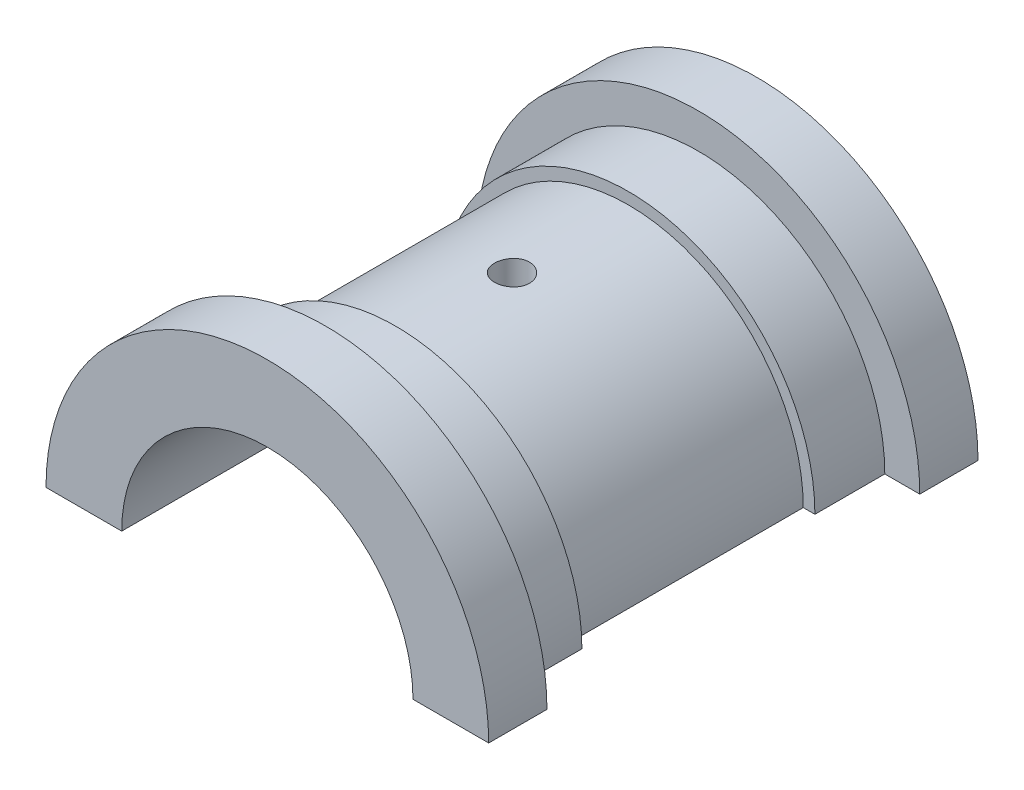
ISO-10303-21;
HEADER;
FILE_DESCRIPTION(('STEP AP214'),'2;1');
FILE_NAME('part.step','',(''),(''),'','','');
FILE_SCHEMA(('AUTOMOTIVE_DESIGN { 1 0 10303 214 1 1 1 1 }'));
ENDSEC;
DATA;
#1=APPLICATION_CONTEXT('core data for automotive mechanical design processes');
#2=APPLICATION_PROTOCOL_DEFINITION('international standard','automotive_design',2000,#1);
#3=PRODUCT_CONTEXT('',#1,'mechanical');
#4=PRODUCT('Part','Part','',(#3));
#5=PRODUCT_RELATED_PRODUCT_CATEGORY('part','',(#4));
#6=PRODUCT_DEFINITION_FORMATION('','',#4);
#7=PRODUCT_DEFINITION_CONTEXT('part definition',#1,'design');
#8=PRODUCT_DEFINITION('design','',#6,#7);
#9=PRODUCT_DEFINITION_SHAPE('','',#8);
#10=(LENGTH_UNIT() NAMED_UNIT(*) SI_UNIT(.MILLI.,.METRE.));
#11=(NAMED_UNIT(*) PLANE_ANGLE_UNIT() SI_UNIT($,.RADIAN.));
#12=(NAMED_UNIT(*) SI_UNIT($,.STERADIAN.) SOLID_ANGLE_UNIT());
#13=UNCERTAINTY_MEASURE_WITH_UNIT(LENGTH_MEASURE(1.E-05),#10,'distance_accuracy_value','');
#14=(GEOMETRIC_REPRESENTATION_CONTEXT(3) GLOBAL_UNCERTAINTY_ASSIGNED_CONTEXT((#13)) GLOBAL_UNIT_ASSIGNED_CONTEXT((#10,
#11,#12)) REPRESENTATION_CONTEXT('',''));
#15=CARTESIAN_POINT('',(0.,0.,0.));
#16=DIRECTION('',(0.,0.,1.));
#17=DIRECTION('',(1.,0.,0.));
#18=AXIS2_PLACEMENT_3D('',#15,#16,#17);
#19=CARTESIAN_POINT('',(0.,0.,0.));
#20=DIRECTION('',(0.,0.,1.));
#21=DIRECTION('',(1.,0.,0.));
#22=AXIS2_PLACEMENT_3D('',#19,#20,#21);
#23=CYLINDRICAL_SURFACE('',#22,25.);
#24=CARTESIAN_POINT('',(0.,25.,3.));
#25=CARTESIAN_POINT('',(0.167864047107699,24.9999977357459,2.99999283605857));
#26=CARTESIAN_POINT('',(0.335834317331191,24.9982914200408,2.98586334130732));
#27=CARTESIAN_POINT('',(0.66710457130825,24.991648705422,2.92971893584462));
#28=CARTESIAN_POINT('',(0.830399429590069,24.9867088933728,2.88767455874941));
#29=CARTESIAN_POINT('',(1.14747479534053,24.9741559265426,2.77695372347399));
#30=CARTESIAN_POINT('',(1.30126148759225,24.9665445315309,2.70829479317582));
#31=CARTESIAN_POINT('',(1.595099157832,24.9494959264345,2.5463312649167));
#32=CARTESIAN_POINT('',(1.73515256713516,24.9400590404141,2.45303104024669));
#33=CARTESIAN_POINT('',(1.99829131534451,24.920360105442,2.24392513802476));
#34=CARTESIAN_POINT('',(2.1212966913072,24.9100945030904,2.12801915988808));
#35=CARTESIAN_POINT('',(2.34615931038342,24.8899239397152,1.8772070351121));
#36=CARTESIAN_POINT('',(2.44801549826474,24.8800189967068,1.74229994098135));
#37=CARTESIAN_POINT('',(2.62798342873896,24.8616560370405,1.45679917470162));
#38=CARTESIAN_POINT('',(2.7060207567257,24.8532025903971,1.30615827541986));
#39=CARTESIAN_POINT('',(2.8356605730156,24.8387461344686,0.993791297891255));
#40=CARTESIAN_POINT('',(2.88726398696776,24.8327430393798,0.832065608030697));
#41=CARTESIAN_POINT('',(2.96232930045399,24.8239006073737,0.502947140688578));
#42=CARTESIAN_POINT('',(2.98592577987646,24.8210461452543,0.335585471572324));
#43=CARTESIAN_POINT('',(3.0047237521967,24.8187777690611,-0.000744936364164433));
#44=CARTESIAN_POINT('',(2.99992630052848,24.8193637271033,-0.169713615216966));
#45=CARTESIAN_POINT('',(2.96218316078668,24.8238961466306,-0.503525964784349));
#46=CARTESIAN_POINT('',(2.92938543222303,24.8278249434675,-0.668386638680178));
#47=CARTESIAN_POINT('',(2.83680346170067,24.8385728087608,-0.990247027821361));
#48=CARTESIAN_POINT('',(2.77701871225814,24.8453919315688,-1.147246595179));
#49=CARTESIAN_POINT('',(2.63199980699862,24.8611722079476,-1.44938946823911));
#50=CARTESIAN_POINT('',(2.54670106203925,24.8701387862198,-1.59450147835355));
#51=CARTESIAN_POINT('',(2.35312173169469,24.8891993987901,-1.86840721091576));
#52=CARTESIAN_POINT('',(2.24484017723157,24.8992934806213,-1.99720024490257));
#53=CARTESIAN_POINT('',(2.0075475556218,24.9195503308637,-2.23567108436438));
#54=CARTESIAN_POINT('',(1.87840890051216,24.929713127424,-2.34522196985706));
#55=CARTESIAN_POINT('',(1.60350795893872,24.9489020798549,-2.54111152100031));
#56=CARTESIAN_POINT('',(1.45774563908005,24.9579282334421,-2.62745014001915));
#57=CARTESIAN_POINT('',(1.15363930826285,24.9738318861702,-2.77446328563966));
#58=CARTESIAN_POINT('',(0.995291578715591,24.9807087472809,-2.83513019333044));
#59=CARTESIAN_POINT('',(0.67055602227344,24.991533065309,-2.9289787378509));
#60=CARTESIAN_POINT('',(0.504168542441623,24.9954806485584,-2.96216156000448));
#61=CARTESIAN_POINT('',(0.169174396374217,24.9999852500304,-2.99993625549769));
#62=CARTESIAN_POINT('',(0.000587720432051444,25.0005630093753,-3.0047030324007));
#63=CARTESIAN_POINT('',(-0.33498206824326,24.9983187823231,-2.98597142213173));
#64=CARTESIAN_POINT('',(-0.501965212327328,24.9954968625308,-2.96247358870465));
#65=CARTESIAN_POINT('',(-0.829074263928356,24.9867833380686,-2.88802503599691));
#66=CARTESIAN_POINT('',(-0.989219346369034,24.9809010237909,-2.83715738694992));
#67=CARTESIAN_POINT('',(-1.29870539768646,24.9667255501792,-2.70949929664642));
#68=CARTESIAN_POINT('',(-1.44804602592347,24.9584323148759,-2.63270803850991));
#69=CARTESIAN_POINT('',(-1.73246717766504,24.9403085158695,-2.45495708409757));
#70=CARTESIAN_POINT('',(-1.86747628962751,24.9304708084643,-2.35388386218918));
#71=CARTESIAN_POINT('',(-2.11867625152203,24.9103817919419,-2.13059915359183));
#72=CARTESIAN_POINT('',(-2.23486641472949,24.9001304677484,-2.00838689585205));
#73=CARTESIAN_POINT('',(-2.44574795226154,24.8803059484942,-1.74552438457231));
#74=CARTESIAN_POINT('',(-2.54032363231939,24.8707365831307,-1.60478098465615));
#75=CARTESIAN_POINT('',(-2.70449314429332,24.8534214993383,-1.30930497492444));
#76=CARTESIAN_POINT('',(-2.77408744356074,24.8456757467943,-1.15457262688176));
#77=CARTESIAN_POINT('',(-2.88612996668159,24.8329105734502,-0.835889391105305));
#78=CARTESIAN_POINT('',(-2.92864420159346,24.8278845275633,-0.671961988140609));
#79=CARTESIAN_POINT('',(-2.98553272163516,24.8211085274587,-0.339231030514933));
#80=CARTESIAN_POINT('',(-2.99990820526081,24.8193584337106,-0.170427683842674));
#81=CARTESIAN_POINT('',(-3.00009033817931,24.819336326607,0.166112729637174));
#82=CARTESIAN_POINT('',(-2.98607873671351,24.8210421863943,0.333849725771266));
#83=CARTESIAN_POINT('',(-2.93026848672089,24.8276922947425,0.664566786394168));
#84=CARTESIAN_POINT('',(-2.88846982822067,24.8326365444656,0.827546849175586));
#85=CARTESIAN_POINT('',(-2.77832739820545,24.8451996524586,1.1441045388887));
#86=CARTESIAN_POINT('',(-2.70999165570539,24.8528177016812,1.29768499349548));
#87=CARTESIAN_POINT('',(-2.5487328262801,24.8698714539139,1.5912277470701));
#88=CARTESIAN_POINT('',(-2.45580952709445,24.8793071726153,1.73118992845931));
#89=CARTESIAN_POINT('',(-2.24733689647205,24.8990055122588,1.99445294010884));
#90=CARTESIAN_POINT('',(-2.1316520393015,24.9092728581347,2.11764610326628));
#91=CARTESIAN_POINT('',(-1.88122093334447,24.9294354968169,2.342942479566));
#92=CARTESIAN_POINT('',(-1.74647018263601,24.939330701051,2.44504069762919));
#93=CARTESIAN_POINT('',(-1.46119322465137,24.9576721709324,2.62555057799886));
#94=CARTESIAN_POINT('',(-1.31061323462417,24.966113221621,2.70387772572229));
#95=CARTESIAN_POINT('',(-0.99842275168531,24.9805418519727,2.83402376444257));
#96=CARTESIAN_POINT('',(-0.836824564362144,24.9865321180615,2.88587169618039));
#97=CARTESIAN_POINT('',(-0.561977101236697,24.9939268325999,2.94906342033812));
#98=CARTESIAN_POINT('',(-0.450466569753487,24.996193279433,2.96813748388637));
#99=CARTESIAN_POINT('',(-0.225986735693694,24.9992306204204,2.99360814349096));
#100=CARTESIAN_POINT('',(-0.113017442753625,25.0000015244492,3.00000482325045));
#101=CARTESIAN_POINT('',(0.,25.,3.));
#102=B_SPLINE_CURVE_WITH_KNOTS('',3,(#24,#25,#26,#27,#28,#29,#30,#31,#32,#33,#34,#35,#36,#37,
#38,#39,#40,#41,#42,#43,#44,#45,#46,#47,#48,#49,#50,#51,#52,#53,#54,#55,#56,#57,#58,#59,#60,#61,
#62,#63,#64,#65,#66,#67,#68,#69,#70,#71,#72,#73,#74,#75,#76,#77,#78,#79,#80,#81,#82,#83,#84,#85,
#86,#87,#88,#89,#90,#91,#92,#93,#94,#95,#96,#97,#98,#99,#100,#101),.UNSPECIFIED.,.T.,.F.,(4,2,2,
2,2,2,2,2,2,2,2,2,2,2,2,2,2,2,2,2,2,2,2,2,2,2,2,2,2,2,2,2,2,2,2,2,2,2,4),(0.,0.503179350956159,
1.00689069408623,1.5102708637556,2.01356175441693,2.51913872195878,3.02474090904883,
3.53190689496397,4.03905511999113,4.54375638343279,5.0484388866848,5.55047092912253,
6.05251241253396,6.55583573710536,7.05918028869262,7.56572944640317,8.07227962172601,
8.57898002694278,9.08565857822619,9.58921522624226,10.0927620090108,10.5947890255775,
11.0968318630167,11.6012692178556,12.1057249760356,12.6128207581672,13.119907053063,
13.6257524826489,14.1315763666154,14.6341719319229,15.1367676776234,15.6392114771388,
16.1416596143121,16.6471952402032,17.1528504352009,17.6602829023946,18.1671576479275,
18.5059342945627,18.8447087043981),.UNSPECIFIED.);
#103=CARTESIAN_POINT('',(0.,25.,3.));
#104=VERTEX_POINT('',#103);
#105=EDGE_CURVE('E150',#104,#104,#102,.T.);
#106=ORIENTED_EDGE('',*,*,#105,.T.);
#107=EDGE_LOOP('',(#106));
#108=FACE_BOUND('',#107,.T.);
#109=CARTESIAN_POINT('',(0.,0.,-42.));
#110=DIRECTION('',(0.,0.,1.));
#111=DIRECTION('',(1.,0.,0.));
#112=AXIS2_PLACEMENT_3D('',#109,#110,#111);
#113=CIRCLE('',#112,25.);
#114=CARTESIAN_POINT('',(25.,0.,-42.));
#115=VERTEX_POINT('',#114);
#116=CARTESIAN_POINT('',(-25.,0.,-42.));
#117=VERTEX_POINT('',#116);
#118=EDGE_CURVE('E46',#115,#117,#113,.T.);
#119=ORIENTED_EDGE('',*,*,#118,.F.);
#120=DIRECTION('',(0.,0.,-1.));
#121=VECTOR('',#120,1.);
#122=CARTESIAN_POINT('',(25.,0.,0.));
#123=LINE('',#122,#121);
#124=CARTESIAN_POINT('',(25.,0.,42.));
#125=VERTEX_POINT('',#124);
#126=EDGE_CURVE('E153',#125,#115,#123,.T.);
#127=ORIENTED_EDGE('',*,*,#126,.F.);
#128=CARTESIAN_POINT('',(0.,0.,42.));
#129=DIRECTION('',(0.,0.,1.));
#130=DIRECTION('',(1.,0.,0.));
#131=AXIS2_PLACEMENT_3D('',#128,#129,#130);
#132=CIRCLE('',#131,25.);
#133=CARTESIAN_POINT('',(-25.,0.,42.));
#134=VERTEX_POINT('',#133);
#135=EDGE_CURVE('E141',#125,#134,#132,.T.);
#136=ORIENTED_EDGE('',*,*,#135,.T.);
#137=DIRECTION('',(0.,0.,-1.));
#138=VECTOR('',#137,1.);
#139=CARTESIAN_POINT('',(-25.,0.,0.));
#140=LINE('',#139,#138);
#141=EDGE_CURVE('E130',#134,#117,#140,.T.);
#142=ORIENTED_EDGE('',*,*,#141,.T.);
#143=EDGE_LOOP('',(#119,#127,#136,#142));
#144=FACE_BOUND('',#143,.T.);
#145=ADVANCED_FACE('F33',(#108,#144),#23,.F.);
#146=CARTESIAN_POINT('',(25.,0.,-42.));
#147=DIRECTION('',(0.,0.,1.));
#148=DIRECTION('',(1.,0.,0.));
#149=AXIS2_PLACEMENT_3D('',#146,#147,#148);
#150=PLANE('',#149);
#151=CARTESIAN_POINT('',(0.,0.,-42.));
#152=DIRECTION('',(0.,0.,1.));
#153=DIRECTION('',(1.,0.,0.));
#154=AXIS2_PLACEMENT_3D('',#151,#152,#153);
#155=CIRCLE('',#154,38.);
#156=CARTESIAN_POINT('',(38.,-1.32676290876039E-13,-42.));
#157=VERTEX_POINT('',#156);
#158=CARTESIAN_POINT('',(-38.,-1.32676290876039E-13,-42.));
#159=VERTEX_POINT('',#158);
#160=EDGE_CURVE('E195',#157,#159,#155,.T.);
#161=ORIENTED_EDGE('',*,*,#160,.F.);
#162=DIRECTION('',(1.,0.,0.));
#163=VECTOR('',#162,1.);
#164=CARTESIAN_POINT('',(25.,0.,-42.));
#165=LINE('',#164,#163);
#166=EDGE_CURVE('E174',#115,#157,#165,.T.);
#167=ORIENTED_EDGE('',*,*,#166,.F.);
#168=ORIENTED_EDGE('',*,*,#118,.T.);
#169=DIRECTION('',(-1.,0.,0.));
#170=VECTOR('',#169,1.);
#171=CARTESIAN_POINT('',(-25.,0.,-42.));
#172=LINE('',#171,#170);
#173=EDGE_CURVE('E138',#117,#159,#172,.T.);
#174=ORIENTED_EDGE('',*,*,#173,.T.);
#175=EDGE_LOOP('',(#161,#167,#168,#174));
#176=FACE_BOUND('',#175,.T.);
#177=ADVANCED_FACE('F198',(#176),#150,.F.);
#178=CARTESIAN_POINT('',(0.,0.,0.));
#179=DIRECTION('',(0.,0.,1.));
#180=DIRECTION('',(1.,0.,0.));
#181=AXIS2_PLACEMENT_3D('',#178,#179,#180);
#182=CYLINDRICAL_SURFACE('',#181,38.);
#183=CARTESIAN_POINT('',(0.,0.,-32.));
#184=DIRECTION('',(0.,0.,1.));
#185=DIRECTION('',(1.,0.,0.));
#186=AXIS2_PLACEMENT_3D('',#183,#184,#185);
#187=CIRCLE('',#186,38.);
#188=CARTESIAN_POINT('',(38.,-1.32676290876039E-13,-32.));
#189=VERTEX_POINT('',#188);
#190=CARTESIAN_POINT('',(-38.,-1.32676290876039E-13,-32.));
#191=VERTEX_POINT('',#190);
#192=EDGE_CURVE('E193',#189,#191,#187,.T.);
#193=ORIENTED_EDGE('',*,*,#192,.F.);
#194=DIRECTION('',(0.,0.,1.));
#195=VECTOR('',#194,1.);
#196=CARTESIAN_POINT('',(38.,-1.32676290876039E-13,-42.));
#197=LINE('',#196,#195);
#198=EDGE_CURVE('E177',#157,#189,#197,.T.);
#199=ORIENTED_EDGE('',*,*,#198,.F.);
#200=ORIENTED_EDGE('',*,*,#160,.T.);
#201=DIRECTION('',(0.,0.,1.));
#202=VECTOR('',#201,1.);
#203=CARTESIAN_POINT('',(-38.,-1.32676290876039E-13,-42.));
#204=LINE('',#203,#202);
#205=EDGE_CURVE('E161',#159,#191,#204,.T.);
#206=ORIENTED_EDGE('',*,*,#205,.T.);
#207=EDGE_LOOP('',(#193,#199,#200,#206));
#208=FACE_BOUND('',#207,.T.);
#209=ADVANCED_FACE('F262',(#208),#182,.T.);
#210=CARTESIAN_POINT('',(38.,-1.32676290876039E-13,-32.));
#211=DIRECTION('',(0.,0.,-1.));
#212=DIRECTION('',(-1.,0.,0.));
#213=AXIS2_PLACEMENT_3D('',#210,#211,#212);
#214=PLANE('',#213);
#215=CARTESIAN_POINT('',(0.,0.,-32.));
#216=DIRECTION('',(0.,0.,1.));
#217=DIRECTION('',(1.,0.,0.));
#218=AXIS2_PLACEMENT_3D('',#215,#216,#217);
#219=CIRCLE('',#218,32.);
#220=CARTESIAN_POINT('',(32.,-1.1172740284298E-13,-32.));
#221=VERTEX_POINT('',#220);
#222=CARTESIAN_POINT('',(-32.,-1.1172740284298E-13,-32.));
#223=VERTEX_POINT('',#222);
#224=EDGE_CURVE('E191',#221,#223,#219,.T.);
#225=ORIENTED_EDGE('',*,*,#224,.F.);
#226=DIRECTION('',(-1.,0.,0.));
#227=VECTOR('',#226,1.);
#228=CARTESIAN_POINT('',(38.,-1.32676290876039E-13,-32.));
#229=LINE('',#228,#227);
#230=EDGE_CURVE('E180',#189,#221,#229,.T.);
#231=ORIENTED_EDGE('',*,*,#230,.F.);
#232=ORIENTED_EDGE('',*,*,#192,.T.);
#233=DIRECTION('',(1.,0.,0.));
#234=VECTOR('',#233,1.);
#235=CARTESIAN_POINT('',(-38.,-1.32676290876039E-13,-32.));
#236=LINE('',#235,#234);
#237=EDGE_CURVE('E164',#191,#223,#236,.T.);
#238=ORIENTED_EDGE('',*,*,#237,.T.);
#239=EDGE_LOOP('',(#225,#231,#232,#238));
#240=FACE_BOUND('',#239,.T.);
#241=ADVANCED_FACE('F260',(#240),#214,.F.);
#242=CARTESIAN_POINT('',(0.,0.,0.));
#243=DIRECTION('',(0.,0.,1.));
#244=DIRECTION('',(1.,0.,0.));
#245=AXIS2_PLACEMENT_3D('',#242,#243,#244);
#246=CYLINDRICAL_SURFACE('',#245,32.);
#247=CARTESIAN_POINT('',(0.,0.,-20.));
#248=DIRECTION('',(0.,0.,1.));
#249=DIRECTION('',(1.,0.,0.));
#250=AXIS2_PLACEMENT_3D('',#247,#248,#249);
#251=CIRCLE('',#250,32.);
#252=CARTESIAN_POINT('',(32.,-1.1172740284298E-13,-20.));
#253=VERTEX_POINT('',#252);
#254=CARTESIAN_POINT('',(-32.,-1.1172740284298E-13,-20.));
#255=VERTEX_POINT('',#254);
#256=EDGE_CURVE('E61',#253,#255,#251,.T.);
#257=ORIENTED_EDGE('',*,*,#256,.F.);
#258=DIRECTION('',(0.,0.,1.));
#259=VECTOR('',#258,1.);
#260=CARTESIAN_POINT('',(32.,-1.1172740284298E-13,-32.));
#261=LINE('',#260,#259);
#262=EDGE_CURVE('E183',#221,#253,#261,.T.);
#263=ORIENTED_EDGE('',*,*,#262,.F.);
#264=ORIENTED_EDGE('',*,*,#224,.T.);
#265=DIRECTION('',(0.,0.,1.));
#266=VECTOR('',#265,1.);
#267=CARTESIAN_POINT('',(-32.,-1.1172740284298E-13,-32.));
#268=LINE('',#267,#266);
#269=EDGE_CURVE('E167',#223,#255,#268,.T.);
#270=ORIENTED_EDGE('',*,*,#269,.T.);
#271=EDGE_LOOP('',(#257,#263,#264,#270));
#272=FACE_BOUND('',#271,.T.);
#273=ADVANCED_FACE('F257',(#272),#246,.T.);
#274=CARTESIAN_POINT('',(32.,-1.1172740284298E-13,-20.));
#275=DIRECTION('',(0.,0.,-1.));
#276=DIRECTION('',(-1.,0.,0.));
#277=AXIS2_PLACEMENT_3D('',#274,#275,#276);
#278=PLANE('',#277);
#279=CARTESIAN_POINT('',(0.,0.,-20.));
#280=DIRECTION('',(0.,0.,1.));
#281=DIRECTION('',(1.,0.,0.));
#282=AXIS2_PLACEMENT_3D('',#279,#280,#281);
#283=CIRCLE('',#282,30.);
#284=CARTESIAN_POINT('',(30.,-1.04744440165294E-13,-20.));
#285=VERTEX_POINT('',#284);
#286=CARTESIAN_POINT('',(-30.,-1.04744440165294E-13,-20.));
#287=VERTEX_POINT('',#286);
#288=EDGE_CURVE('E53',#285,#287,#283,.T.);
#289=ORIENTED_EDGE('',*,*,#288,.F.);
#290=DIRECTION('',(-1.,0.,0.));
#291=VECTOR('',#290,1.);
#292=CARTESIAN_POINT('',(32.,-1.1172740284298E-13,-20.));
#293=LINE('',#292,#291);
#294=EDGE_CURVE('E185',#253,#285,#293,.T.);
#295=ORIENTED_EDGE('',*,*,#294,.F.);
#296=ORIENTED_EDGE('',*,*,#256,.T.);
#297=DIRECTION('',(1.,0.,0.));
#298=VECTOR('',#297,1.);
#299=CARTESIAN_POINT('',(-32.,-1.1172740284298E-13,-20.));
#300=LINE('',#299,#298);
#301=EDGE_CURVE('E169',#255,#287,#300,.T.);
#302=ORIENTED_EDGE('',*,*,#301,.T.);
#303=EDGE_LOOP('',(#289,#295,#296,#302));
#304=FACE_BOUND('',#303,.T.);
#305=ADVANCED_FACE('F256',(#304),#278,.F.);
#306=CARTESIAN_POINT('',(0.,0.,0.));
#307=DIRECTION('',(0.,0.,1.));
#308=DIRECTION('',(1.,0.,0.));
#309=AXIS2_PLACEMENT_3D('',#306,#307,#308);
#310=CYLINDRICAL_SURFACE('',#309,30.);
#311=CARTESIAN_POINT('',(0.,30.,3.));
#312=CARTESIAN_POINT('',(-0.168061061374672,29.9999980656231,2.99999272229886));
#313=CARTESIAN_POINT('',(-0.336233235503319,29.9985727678862,2.98583019331067));
#314=CARTESIAN_POINT('',(-0.667915195490511,29.9930240278421,2.92954688912872));
#315=CARTESIAN_POINT('',(-0.831419637506483,29.9888976130208,2.88739531192623));
#316=CARTESIAN_POINT('',(-1.14891502636024,29.9784124368921,2.7763732782065));
#317=CARTESIAN_POINT('',(-1.30291165384473,29.9720550240212,2.70751895844458));
#318=CARTESIAN_POINT('',(-1.59712848288122,29.9578187218292,2.54507727620507));
#319=CARTESIAN_POINT('',(-1.73735141633723,29.9499401351439,2.45149483199959));
#320=CARTESIAN_POINT('',(-2.00057865202225,29.9335123302397,2.24189190701318));
#321=CARTESIAN_POINT('',(-2.12352643450468,29.924961047216,2.1258006017939));
#322=CARTESIAN_POINT('',(-2.34822756429295,29.9081687071879,1.87462639721091));
#323=CARTESIAN_POINT('',(-2.44997993124796,29.8999276645475,1.73954261987284));
#324=CARTESIAN_POINT('',(-2.62960191133085,29.8846677465835,1.45386440494914));
#325=CARTESIAN_POINT('',(-2.70742039636464,29.8776515013271,1.30323766771543));
#326=CARTESIAN_POINT('',(-2.83663915422828,29.8656611263957,0.990973242285065));
#327=CARTESIAN_POINT('',(-2.88804007977387,29.8606869462667,0.829335826248152));
#328=CARTESIAN_POINT('',(-2.96279712480568,29.8533625221893,0.500214597401973));
#329=CARTESIAN_POINT('',(-2.98624695901139,29.8510035119429,0.332752269443377));
#330=CARTESIAN_POINT('',(-3.00472585540608,29.8491492918158,-0.00374659018734057));
#331=CARTESIAN_POINT('',(-2.9997556646124,29.8496540066624,-0.172783080366177));
#332=CARTESIAN_POINT('',(-2.96161284075804,29.853462206968,-0.506985929079954));
#333=CARTESIAN_POINT('',(-2.92854253237366,29.8567555377195,-0.672164097986082));
#334=CARTESIAN_POINT('',(-2.83529743245176,29.8657540286225,-0.994613889603282));
#335=CARTESIAN_POINT('',(-2.77512227476724,29.8714592213547,-1.15188540547509));
#336=CARTESIAN_POINT('',(-2.62926268164452,29.8846502835621,-1.45438076189667));
#337=CARTESIAN_POINT('',(-2.54353284815994,29.8921393172447,-1.59958256846795));
#338=CARTESIAN_POINT('',(-2.34903008205968,29.9080515519864,-1.87357564473565));
#339=CARTESIAN_POINT('',(-2.24025647500952,29.9164747803835,-2.00236643394529));
#340=CARTESIAN_POINT('',(-2.00218233723621,29.9333515593897,-2.24047618196708));
#341=CARTESIAN_POINT('',(-1.87279343655409,29.9418050799899,-2.34970680564242));
#342=CARTESIAN_POINT('',(-1.59746844521134,29.9577548723555,-2.54491089873116));
#343=CARTESIAN_POINT('',(-1.4515323359988,29.9652511430477,-2.63088434206943));
#344=CARTESIAN_POINT('',(-1.1471943170771,29.9784442700129,-2.77713006093076));
#345=CARTESIAN_POINT('',(-0.988790239169711,29.9841408124431,-2.83739785445418));
#346=CARTESIAN_POINT('',(-0.664041651989798,29.9930894232422,-2.93045675013526));
#347=CARTESIAN_POINT('',(-0.497697380329803,29.9963415647119,-2.96324867397187));
#348=CARTESIAN_POINT('',(-0.162555297275712,30.0000255500493,-3.0003129232043));
#349=CARTESIAN_POINT('',(0.00622890631647499,30.0004694480321,-3.0047071447575));
#350=CARTESIAN_POINT('',(0.342131379947098,29.9985192527039,-2.98517141085371));
#351=CARTESIAN_POINT('',(0.509249672461409,29.996125197734,-2.96124183805416));
#352=CARTESIAN_POINT('',(0.836724620504023,29.9887758461758,-2.88583891373527));
#353=CARTESIAN_POINT('',(0.997094546916057,29.9838258575412,-2.83442263656597));
#354=CARTESIAN_POINT('',(1.30693296415134,29.9719199658183,-2.70556447788819));
#355=CARTESIAN_POINT('',(1.45640121047135,29.9649640177576,-2.62812201288181));
#356=CARTESIAN_POINT('',(1.74074454051643,29.9497942599127,-2.44910748400826));
#357=CARTESIAN_POINT('',(1.87556897924675,29.9415763081032,-2.34745533322255));
#358=CARTESIAN_POINT('',(2.12628486993563,29.9248179860856,-2.12302179677722));
#359=CARTESIAN_POINT('',(2.24217584654753,29.9162776077891,-2.00023988078905));
#360=CARTESIAN_POINT('',(2.45215832966144,29.8998007242226,-1.736500276023));
#361=CARTESIAN_POINT('',(2.54616983603863,29.8918665041692,-1.59547873037214));
#362=CARTESIAN_POINT('',(2.70917477623148,29.8775349738267,-1.29957791955995));
#363=CARTESIAN_POINT('',(2.77816855216165,29.8711376425211,-1.14469884393481));
#364=CARTESIAN_POINT('',(2.88904562605343,29.8606184290215,-0.825753781602618));
#365=CARTESIAN_POINT('',(2.93097652443558,29.8564925534936,-0.661704479726639));
#366=CARTESIAN_POINT('',(2.98669202138839,29.8509709584863,-0.328850406117685));
#367=CARTESIAN_POINT('',(3.00047742719855,29.8495751607056,-0.160045770912979));
#368=CARTESIAN_POINT('',(2.99949941541377,29.8496733932269,0.176732065070113));
#369=CARTESIAN_POINT('',(2.98486166877934,29.8511547026103,0.344705648648444));
#370=CARTESIAN_POINT('',(2.92771635889096,29.8568131166864,0.675794751504863));
#371=CARTESIAN_POINT('',(2.88520876428648,29.8609902244115,0.838910265317938));
#372=CARTESIAN_POINT('',(2.77356505889251,29.8715660478956,1.15565204714357));
#373=CARTESIAN_POINT('',(2.70443263302275,29.8779644562108,1.30927962488917));
#374=CARTESIAN_POINT('',(2.54151466473313,29.8922625551808,1.6027706750131));
#375=CARTESIAN_POINT('',(2.44772926036624,29.9001622374285,1.74263422446189));
#376=CARTESIAN_POINT('',(2.23769566885599,29.9166146162909,2.00527102341581));
#377=CARTESIAN_POINT('',(2.12135384667081,29.9251699418025,2.12796922910126));
#378=CARTESIAN_POINT('',(1.86969509767533,29.9419456418635,2.35215669809897));
#379=CARTESIAN_POINT('',(1.73437363232477,29.9501659356893,2.45364087407151));
#380=CARTESIAN_POINT('',(1.44822430248387,29.9653668620748,2.63272036156386));
#381=CARTESIAN_POINT('',(1.29735824804029,29.9723443208044,2.71025487283555));
#382=CARTESIAN_POINT('',(0.984774837301653,29.9842388774969,2.8387872684716));
#383=CARTESIAN_POINT('',(0.823069949476829,29.9891582972896,2.88981507286064));
#384=CARTESIAN_POINT('',(0.550374784217114,29.995146413212,2.95116185125441));
#385=CARTESIAN_POINT('',(0.441127658533527,29.996958020755,2.96945113289807));
#386=CARTESIAN_POINT('',(0.221269742451939,29.9993854485236,2.99387257818529));
#387=CARTESIAN_POINT('',(0.110658957679674,30.0000012736807,3.00000479196559));
#388=CARTESIAN_POINT('',(0.,30.,3.));
#389=B_SPLINE_CURVE_WITH_KNOTS('',3,(#311,#312,#313,#314,#315,#316,#317,#318,#319,#320,#321,
#322,#323,#324,#325,#326,#327,#328,#329,#330,#331,#332,#333,#334,#335,#336,#337,#338,#339,#340,
#341,#342,#343,#344,#345,#346,#347,#348,#349,#350,#351,#352,#353,#354,#355,#356,#357,#358,#359,
#360,#361,#362,#363,#364,#365,#366,#367,#368,#369,#370,#371,#372,#373,#374,#375,#376,#377,#378,
#379,#380,#381,#382,#383,#384,#385,#386,#387,#388),.UNSPECIFIED.,.T.,.F.,(4,2,2,2,2,2,2,2,2,2,2,
2,2,2,2,2,2,2,2,2,2,2,2,2,2,2,2,2,2,2,2,2,2,2,2,2,2,2,4),(0.,0.503779098805421,1.00811352850646,
1.51214365719661,2.01607361274835,2.52161570586883,3.02718117662117,3.53381926416665,
4.04044483327512,4.5453669613559,5.05027581767329,5.55335392323331,6.05643882484901,
6.56042284118684,7.06442160993376,7.57064202588619,8.07686300939315,8.58317222080744,
9.08946629026318,9.59358565823273,10.0976982155743,10.6007680588291,11.103849181484,
11.608618222461,12.1133999343069,12.619999308258,13.1265917542612,13.6322907177901,
14.1379751771876,14.6414288788187,15.1448831467812,15.648267760884,16.1516495561688,
16.6571675228296,17.1628065791087,17.6697189307873,18.1760578438588,18.5077700169705,
18.8394808220708),.UNSPECIFIED.);
#390=CARTESIAN_POINT('',(0.,30.,3.));
#391=VERTEX_POINT('',#390);
#392=EDGE_CURVE('E11',#391,#391,#389,.T.);
#393=ORIENTED_EDGE('',*,*,#392,.T.);
#394=EDGE_LOOP('',(#393));
#395=FACE_BOUND('',#394,.T.);
#396=DIRECTION('',(0.,0.,1.));
#397=VECTOR('',#396,1.);
#398=CARTESIAN_POINT('',(30.,-1.04744440165294E-13,-20.));
#399=LINE('',#398,#397);
#400=CARTESIAN_POINT('',(30.,-1.04744440165294E-13,20.));
#401=VERTEX_POINT('',#400);
#402=EDGE_CURVE('E187',#285,#401,#399,.T.);
#403=ORIENTED_EDGE('',*,*,#402,.F.);
#404=ORIENTED_EDGE('',*,*,#288,.T.);
#405=DIRECTION('',(0.,0.,1.));
#406=VECTOR('',#405,1.);
#407=CARTESIAN_POINT('',(-30.,-1.04744440165294E-13,-20.));
#408=LINE('',#407,#406);
#409=CARTESIAN_POINT('',(-30.,-1.04744440165294E-13,20.));
#410=VERTEX_POINT('',#409);
#411=EDGE_CURVE('E171',#287,#410,#408,.T.);
#412=ORIENTED_EDGE('',*,*,#411,.T.);
#413=CARTESIAN_POINT('',(0.,0.,20.));
#414=DIRECTION('',(0.,0.,1.));
#415=DIRECTION('',(1.,0.,0.));
#416=AXIS2_PLACEMENT_3D('',#413,#414,#415);
#417=CIRCLE('',#416,30.);
#418=EDGE_CURVE('E222',#401,#410,#417,.T.);
#419=ORIENTED_EDGE('',*,*,#418,.F.);
#420=EDGE_LOOP('',(#403,#404,#412,#419));
#421=FACE_BOUND('',#420,.T.);
#422=ADVANCED_FACE('F252',(#395,#421),#310,.T.);
#423=CARTESIAN_POINT('',(0.,0.,0.));
#424=DIRECTION('',(0.,-1.,0.));
#425=DIRECTION('',(0.,0.,-1.));
#426=AXIS2_PLACEMENT_3D('',#423,#424,#425);
#427=PLANE('',#426);
#428=ORIENTED_EDGE('',*,*,#402,.T.);
#429=DIRECTION('',(-1.,0.,0.));
#430=VECTOR('',#429,1.);
#431=CARTESIAN_POINT('',(32.,-1.1172740284298E-13,20.));
#432=LINE('',#431,#430);
#433=CARTESIAN_POINT('',(32.,-1.1172740284298E-13,20.));
#434=VERTEX_POINT('',#433);
#435=EDGE_CURVE('E219',#434,#401,#432,.T.);
#436=ORIENTED_EDGE('',*,*,#435,.F.);
#437=DIRECTION('',(0.,0.,-1.));
#438=VECTOR('',#437,1.);
#439=CARTESIAN_POINT('',(32.,-1.1172740284298E-13,32.));
#440=LINE('',#439,#438);
#441=CARTESIAN_POINT('',(32.,-1.1172740284298E-13,32.));
#442=VERTEX_POINT('',#441);
#443=EDGE_CURVE('E216',#442,#434,#440,.T.);
#444=ORIENTED_EDGE('',*,*,#443,.F.);
#445=DIRECTION('',(-1.,0.,0.));
#446=VECTOR('',#445,1.);
#447=CARTESIAN_POINT('',(38.,-1.32676290876039E-13,32.));
#448=LINE('',#447,#446);
#449=CARTESIAN_POINT('',(38.,-1.32676290876039E-13,32.));
#450=VERTEX_POINT('',#449);
#451=EDGE_CURVE('E207',#450,#442,#448,.T.);
#452=ORIENTED_EDGE('',*,*,#451,.F.);
#453=DIRECTION('',(0.,0.,-1.));
#454=VECTOR('',#453,1.);
#455=CARTESIAN_POINT('',(38.,-1.32676290876039E-13,42.));
#456=LINE('',#455,#454);
#457=CARTESIAN_POINT('',(38.,-1.32676290876039E-13,42.));
#458=VERTEX_POINT('',#457);
#459=EDGE_CURVE('E204',#458,#450,#456,.T.);
#460=ORIENTED_EDGE('',*,*,#459,.F.);
#461=DIRECTION('',(1.,0.,0.));
#462=VECTOR('',#461,1.);
#463=CARTESIAN_POINT('',(25.,0.,42.));
#464=LINE('',#463,#462);
#465=EDGE_CURVE('E202',#125,#458,#464,.T.);
#466=ORIENTED_EDGE('',*,*,#465,.F.);
#467=ORIENTED_EDGE('',*,*,#126,.T.);
#468=ORIENTED_EDGE('',*,*,#166,.T.);
#469=ORIENTED_EDGE('',*,*,#198,.T.);
#470=ORIENTED_EDGE('',*,*,#230,.T.);
#471=ORIENTED_EDGE('',*,*,#262,.T.);
#472=ORIENTED_EDGE('',*,*,#294,.T.);
#473=EDGE_LOOP('',(#428,#436,#444,#452,#460,#466,#467,#468,#469,#470,#471,#472));
#474=FACE_BOUND('',#473,.T.);
#475=ADVANCED_FACE('F200',(#474),#427,.T.);
#476=CARTESIAN_POINT('',(0.,0.,0.));
#477=DIRECTION('',(0.,1.,0.));
#478=DIRECTION('',(0.,0.,-1.));
#479=AXIS2_PLACEMENT_3D('',#476,#477,#478);
#480=PLANE('',#479);
#481=ORIENTED_EDGE('',*,*,#141,.F.);
#482=DIRECTION('',(-1.,0.,0.));
#483=VECTOR('',#482,1.);
#484=CARTESIAN_POINT('',(-25.,0.,42.));
#485=LINE('',#484,#483);
#486=CARTESIAN_POINT('',(-38.,-1.32676290876039E-13,42.));
#487=VERTEX_POINT('',#486);
#488=EDGE_CURVE('E134',#134,#487,#485,.T.);
#489=ORIENTED_EDGE('',*,*,#488,.T.);
#490=DIRECTION('',(0.,0.,-1.));
#491=VECTOR('',#490,1.);
#492=CARTESIAN_POINT('',(-38.,-1.32676290876039E-13,42.));
#493=LINE('',#492,#491);
#494=CARTESIAN_POINT('',(-38.,-1.32676290876039E-13,32.));
#495=VERTEX_POINT('',#494);
#496=EDGE_CURVE('E149',#487,#495,#493,.T.);
#497=ORIENTED_EDGE('',*,*,#496,.T.);
#498=DIRECTION('',(1.,0.,0.));
#499=VECTOR('',#498,1.);
#500=CARTESIAN_POINT('',(-38.,-1.32676290876039E-13,32.));
#501=LINE('',#500,#499);
#502=CARTESIAN_POINT('',(-32.,-1.1172740284298E-13,32.));
#503=VERTEX_POINT('',#502);
#504=EDGE_CURVE('E238',#495,#503,#501,.T.);
#505=ORIENTED_EDGE('',*,*,#504,.T.);
#506=DIRECTION('',(0.,0.,-1.));
#507=VECTOR('',#506,1.);
#508=CARTESIAN_POINT('',(-32.,-1.1172740284298E-13,32.));
#509=LINE('',#508,#507);
#510=CARTESIAN_POINT('',(-32.,-1.1172740284298E-13,20.));
#511=VERTEX_POINT('',#510);
#512=EDGE_CURVE('E210',#503,#511,#509,.T.);
#513=ORIENTED_EDGE('',*,*,#512,.T.);
#514=DIRECTION('',(1.,0.,0.));
#515=VECTOR('',#514,1.);
#516=CARTESIAN_POINT('',(-32.,-1.1172740284298E-13,20.));
#517=LINE('',#516,#515);
#518=EDGE_CURVE('E205',#511,#410,#517,.T.);
#519=ORIENTED_EDGE('',*,*,#518,.T.);
#520=ORIENTED_EDGE('',*,*,#411,.F.);
#521=ORIENTED_EDGE('',*,*,#301,.F.);
#522=ORIENTED_EDGE('',*,*,#269,.F.);
#523=ORIENTED_EDGE('',*,*,#237,.F.);
#524=ORIENTED_EDGE('',*,*,#205,.F.);
#525=ORIENTED_EDGE('',*,*,#173,.F.);
#526=EDGE_LOOP('',(#481,#489,#497,#505,#513,#519,#520,#521,#522,#523,#524,#525));
#527=FACE_BOUND('',#526,.T.);
#528=ADVANCED_FACE('F132',(#527),#480,.F.);
#529=CARTESIAN_POINT('',(25.,0.,42.));
#530=DIRECTION('',(0.,0.,-1.));
#531=DIRECTION('',(1.,0.,0.));
#532=AXIS2_PLACEMENT_3D('',#529,#530,#531);
#533=PLANE('',#532);
#534=CARTESIAN_POINT('',(0.,0.,42.));
#535=DIRECTION('',(0.,0.,1.));
#536=DIRECTION('',(1.,0.,0.));
#537=AXIS2_PLACEMENT_3D('',#534,#535,#536);
#538=CIRCLE('',#537,38.);
#539=EDGE_CURVE('E148',#458,#487,#538,.T.);
#540=ORIENTED_EDGE('',*,*,#539,.T.);
#541=ORIENTED_EDGE('',*,*,#488,.F.);
#542=ORIENTED_EDGE('',*,*,#135,.F.);
#543=ORIENTED_EDGE('',*,*,#465,.T.);
#544=EDGE_LOOP('',(#540,#541,#542,#543));
#545=FACE_BOUND('',#544,.T.);
#546=ADVANCED_FACE('F145',(#545),#533,.F.);
#547=CARTESIAN_POINT('',(0.,0.,0.));
#548=DIRECTION('',(0.,0.,-1.));
#549=DIRECTION('',(1.,0.,0.));
#550=AXIS2_PLACEMENT_3D('',#547,#548,#549);
#551=CYLINDRICAL_SURFACE('',#550,38.);
#552=CARTESIAN_POINT('',(0.,0.,32.));
#553=DIRECTION('',(0.,0.,1.));
#554=DIRECTION('',(1.,0.,0.));
#555=AXIS2_PLACEMENT_3D('',#552,#553,#554);
#556=CIRCLE('',#555,38.);
#557=EDGE_CURVE('E156',#450,#495,#556,.T.);
#558=ORIENTED_EDGE('',*,*,#557,.T.);
#559=ORIENTED_EDGE('',*,*,#496,.F.);
#560=ORIENTED_EDGE('',*,*,#539,.F.);
#561=ORIENTED_EDGE('',*,*,#459,.T.);
#562=EDGE_LOOP('',(#558,#559,#560,#561));
#563=FACE_BOUND('',#562,.T.);
#564=ADVANCED_FACE('F233',(#563),#551,.T.);
#565=CARTESIAN_POINT('',(38.,-1.32676290876039E-13,32.));
#566=DIRECTION('',(0.,0.,1.));
#567=DIRECTION('',(-1.,0.,0.));
#568=AXIS2_PLACEMENT_3D('',#565,#566,#567);
#569=PLANE('',#568);
#570=CARTESIAN_POINT('',(0.,0.,32.));
#571=DIRECTION('',(0.,0.,1.));
#572=DIRECTION('',(1.,0.,0.));
#573=AXIS2_PLACEMENT_3D('',#570,#571,#572);
#574=CIRCLE('',#573,32.);
#575=EDGE_CURVE('E228',#442,#503,#574,.T.);
#576=ORIENTED_EDGE('',*,*,#575,.T.);
#577=ORIENTED_EDGE('',*,*,#504,.F.);
#578=ORIENTED_EDGE('',*,*,#557,.F.);
#579=ORIENTED_EDGE('',*,*,#451,.T.);
#580=EDGE_LOOP('',(#576,#577,#578,#579));
#581=FACE_BOUND('',#580,.T.);
#582=ADVANCED_FACE('F235',(#581),#569,.F.);
#583=CARTESIAN_POINT('',(0.,0.,0.));
#584=DIRECTION('',(0.,0.,-1.));
#585=DIRECTION('',(1.,0.,0.));
#586=AXIS2_PLACEMENT_3D('',#583,#584,#585);
#587=CYLINDRICAL_SURFACE('',#586,32.);
#588=CARTESIAN_POINT('',(0.,0.,20.));
#589=DIRECTION('',(0.,0.,1.));
#590=DIRECTION('',(1.,0.,0.));
#591=AXIS2_PLACEMENT_3D('',#588,#589,#590);
#592=CIRCLE('',#591,32.);
#593=EDGE_CURVE('E225',#434,#511,#592,.T.);
#594=ORIENTED_EDGE('',*,*,#593,.T.);
#595=ORIENTED_EDGE('',*,*,#512,.F.);
#596=ORIENTED_EDGE('',*,*,#575,.F.);
#597=ORIENTED_EDGE('',*,*,#443,.T.);
#598=EDGE_LOOP('',(#594,#595,#596,#597));
#599=FACE_BOUND('',#598,.T.);
#600=ADVANCED_FACE('F246',(#599),#587,.T.);
#601=CARTESIAN_POINT('',(32.,-1.1172740284298E-13,20.));
#602=DIRECTION('',(0.,0.,1.));
#603=DIRECTION('',(-1.,0.,0.));
#604=AXIS2_PLACEMENT_3D('',#601,#602,#603);
#605=PLANE('',#604);
#606=ORIENTED_EDGE('',*,*,#418,.T.);
#607=ORIENTED_EDGE('',*,*,#518,.F.);
#608=ORIENTED_EDGE('',*,*,#593,.F.);
#609=ORIENTED_EDGE('',*,*,#435,.T.);
#610=EDGE_LOOP('',(#606,#607,#608,#609));
#611=FACE_BOUND('',#610,.T.);
#612=ADVANCED_FACE('F248',(#611),#605,.F.);
#613=CARTESIAN_POINT('',(0.,-1.31838984174237E-13,0.));
#614=DIRECTION('',(0.,1.,0.));
#615=DIRECTION('',(0.,0.,1.));
#616=AXIS2_PLACEMENT_3D('',#613,#614,#615);
#617=CYLINDRICAL_SURFACE('',#616,3.);
#618=ORIENTED_EDGE('',*,*,#392,.F.);
#619=EDGE_LOOP('',(#618));
#620=FACE_BOUND('',#619,.T.);
#621=ORIENTED_EDGE('',*,*,#105,.F.);
#622=EDGE_LOOP('',(#621));
#623=FACE_BOUND('',#622,.T.);
#624=ADVANCED_FACE('F280',(#620,#623),#617,.F.);
#625=CLOSED_SHELL('',(#145,#177,#209,#241,#273,#305,#422,#475,#528,#546,#564,#582,#600,#612,#624));
#626=MANIFOLD_SOLID_BREP('B2',#625);
#627=ADVANCED_BREP_SHAPE_REPRESENTATION('',(#18,#626),#14);
#628=SHAPE_DEFINITION_REPRESENTATION(#9,#627);
ENDSEC;
END-ISO-10303-21;
